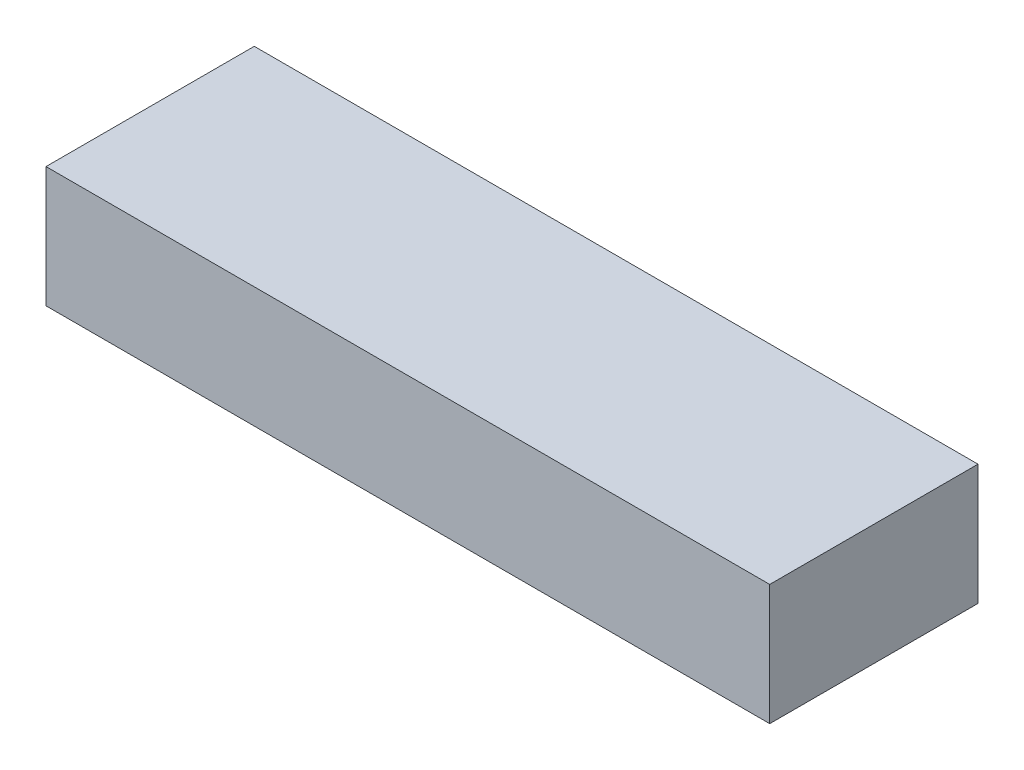
ISO-10303-21;
HEADER;
FILE_DESCRIPTION(('STEP AP214'),'2;1');
FILE_NAME('part.step','',(''),(''),'','','');
FILE_SCHEMA(('AUTOMOTIVE_DESIGN { 1 0 10303 214 1 1 1 1 }'));
ENDSEC;
DATA;
#1=APPLICATION_CONTEXT('core data for automotive mechanical design processes');
#2=APPLICATION_PROTOCOL_DEFINITION('international standard','automotive_design',2000,#1);
#3=PRODUCT_CONTEXT('',#1,'mechanical');
#4=PRODUCT('Part','Part','',(#3));
#5=PRODUCT_RELATED_PRODUCT_CATEGORY('part','',(#4));
#6=PRODUCT_DEFINITION_FORMATION('','',#4);
#7=PRODUCT_DEFINITION_CONTEXT('part definition',#1,'design');
#8=PRODUCT_DEFINITION('design','',#6,#7);
#9=PRODUCT_DEFINITION_SHAPE('','',#8);
#10=(LENGTH_UNIT() NAMED_UNIT(*) SI_UNIT(.MILLI.,.METRE.));
#11=(NAMED_UNIT(*) PLANE_ANGLE_UNIT() SI_UNIT($,.RADIAN.));
#12=(NAMED_UNIT(*) SI_UNIT($,.STERADIAN.) SOLID_ANGLE_UNIT());
#13=UNCERTAINTY_MEASURE_WITH_UNIT(LENGTH_MEASURE(1.E-05),#10,'distance_accuracy_value','');
#14=(GEOMETRIC_REPRESENTATION_CONTEXT(3) GLOBAL_UNCERTAINTY_ASSIGNED_CONTEXT((#13)) GLOBAL_UNIT_ASSIGNED_CONTEXT((#10,
#11,#12)) REPRESENTATION_CONTEXT('',''));
#15=CARTESIAN_POINT('',(0.,0.,0.));
#16=DIRECTION('',(0.,0.,1.));
#17=DIRECTION('',(1.,0.,0.));
#18=AXIS2_PLACEMENT_3D('',#15,#16,#17);
#19=CARTESIAN_POINT('',(0.,3.,0.));
#20=DIRECTION('',(1.,0.,0.));
#21=DIRECTION('',(0.,0.,-1.));
#22=AXIS2_PLACEMENT_3D('',#19,#20,#21);
#23=PLANE('',#22);
#24=DIRECTION('',(0.,0.,1.));
#25=VECTOR('',#24,1.);
#26=CARTESIAN_POINT('',(0.,0.,0.));
#27=LINE('',#26,#25);
#28=CARTESIAN_POINT('',(0.,0.,-5.18));
#29=VERTEX_POINT('',#28);
#30=CARTESIAN_POINT('',(0.,0.,0.));
#31=VERTEX_POINT('',#30);
#32=EDGE_CURVE('E95',#29,#31,#27,.T.);
#33=ORIENTED_EDGE('',*,*,#32,.T.);
#34=DIRECTION('',(0.,-1.,0.));
#35=VECTOR('',#34,1.);
#36=CARTESIAN_POINT('',(0.,3.,0.));
#37=LINE('',#36,#35);
#38=CARTESIAN_POINT('',(0.,3.,0.));
#39=VERTEX_POINT('',#38);
#40=EDGE_CURVE('E11',#39,#31,#37,.T.);
#41=ORIENTED_EDGE('',*,*,#40,.F.);
#42=DIRECTION('',(0.,0.,1.));
#43=VECTOR('',#42,1.);
#44=CARTESIAN_POINT('',(0.,3.,0.));
#45=LINE('',#44,#43);
#46=CARTESIAN_POINT('',(0.,3.,-5.18));
#47=VERTEX_POINT('',#46);
#48=EDGE_CURVE('E83',#47,#39,#45,.T.);
#49=ORIENTED_EDGE('',*,*,#48,.F.);
#50=DIRECTION('',(0.,-1.,0.));
#51=VECTOR('',#50,1.);
#52=CARTESIAN_POINT('',(0.,3.,-5.18));
#53=LINE('',#52,#51);
#54=EDGE_CURVE('E91',#47,#29,#53,.T.);
#55=ORIENTED_EDGE('',*,*,#54,.T.);
#56=EDGE_LOOP('',(#33,#41,#49,#55));
#57=FACE_BOUND('',#56,.T.);
#58=ADVANCED_FACE('F32',(#57),#23,.F.);
#59=CARTESIAN_POINT('',(0.,3.,0.));
#60=DIRECTION('',(0.,0.,-1.));
#61=DIRECTION('',(-1.,0.,0.));
#62=AXIS2_PLACEMENT_3D('',#59,#60,#61);
#63=PLANE('',#62);
#64=DIRECTION('',(1.,0.,0.));
#65=VECTOR('',#64,1.);
#66=CARTESIAN_POINT('',(0.,0.,0.));
#67=LINE('',#66,#65);
#68=CARTESIAN_POINT('',(18.,0.,0.));
#69=VERTEX_POINT('',#68);
#70=EDGE_CURVE('E87',#31,#69,#67,.T.);
#71=ORIENTED_EDGE('',*,*,#70,.T.);
#72=DIRECTION('',(0.,-1.,0.));
#73=VECTOR('',#72,1.);
#74=CARTESIAN_POINT('',(18.,3.,0.));
#75=LINE('',#74,#73);
#76=CARTESIAN_POINT('',(18.,3.,0.));
#77=VERTEX_POINT('',#76);
#78=EDGE_CURVE('E40',#77,#69,#75,.T.);
#79=ORIENTED_EDGE('',*,*,#78,.F.);
#80=DIRECTION('',(1.,0.,0.));
#81=VECTOR('',#80,1.);
#82=CARTESIAN_POINT('',(0.,3.,0.));
#83=LINE('',#82,#81);
#84=EDGE_CURVE('E78',#39,#77,#83,.T.);
#85=ORIENTED_EDGE('',*,*,#84,.F.);
#86=ORIENTED_EDGE('',*,*,#40,.T.);
#87=EDGE_LOOP('',(#71,#79,#85,#86));
#88=FACE_BOUND('',#87,.T.);
#89=ADVANCED_FACE('F86',(#88),#63,.F.);
#90=CARTESIAN_POINT('',(18.,3.,0.));
#91=DIRECTION('',(-1.,0.,0.));
#92=DIRECTION('',(0.,0.,1.));
#93=AXIS2_PLACEMENT_3D('',#90,#91,#92);
#94=PLANE('',#93);
#95=DIRECTION('',(0.,0.,-1.));
#96=VECTOR('',#95,1.);
#97=CARTESIAN_POINT('',(18.,0.,0.));
#98=LINE('',#97,#96);
#99=CARTESIAN_POINT('',(18.,0.,-5.18));
#100=VERTEX_POINT('',#99);
#101=EDGE_CURVE('E65',#69,#100,#98,.T.);
#102=ORIENTED_EDGE('',*,*,#101,.T.);
#103=DIRECTION('',(0.,-1.,0.));
#104=VECTOR('',#103,1.);
#105=CARTESIAN_POINT('',(18.,3.,-5.18));
#106=LINE('',#105,#104);
#107=CARTESIAN_POINT('',(18.,3.,-5.18));
#108=VERTEX_POINT('',#107);
#109=EDGE_CURVE('E88',#108,#100,#106,.T.);
#110=ORIENTED_EDGE('',*,*,#109,.F.);
#111=DIRECTION('',(0.,0.,-1.));
#112=VECTOR('',#111,1.);
#113=CARTESIAN_POINT('',(18.,3.,0.));
#114=LINE('',#113,#112);
#115=EDGE_CURVE('E81',#77,#108,#114,.T.);
#116=ORIENTED_EDGE('',*,*,#115,.F.);
#117=ORIENTED_EDGE('',*,*,#78,.T.);
#118=EDGE_LOOP('',(#102,#110,#116,#117));
#119=FACE_BOUND('',#118,.T.);
#120=ADVANCED_FACE('F89',(#119),#94,.F.);
#121=CARTESIAN_POINT('',(0.,3.,-5.18));
#122=DIRECTION('',(0.,0.,1.));
#123=DIRECTION('',(1.,0.,0.));
#124=AXIS2_PLACEMENT_3D('',#121,#122,#123);
#125=PLANE('',#124);
#126=DIRECTION('',(-1.,0.,0.));
#127=VECTOR('',#126,1.);
#128=CARTESIAN_POINT('',(0.,0.,-5.18));
#129=LINE('',#128,#127);
#130=EDGE_CURVE('E71',#100,#29,#129,.T.);
#131=ORIENTED_EDGE('',*,*,#130,.T.);
#132=ORIENTED_EDGE('',*,*,#54,.F.);
#133=DIRECTION('',(-1.,0.,0.));
#134=VECTOR('',#133,1.);
#135=CARTESIAN_POINT('',(0.,3.,-5.18));
#136=LINE('',#135,#134);
#137=EDGE_CURVE('E48',#108,#47,#136,.T.);
#138=ORIENTED_EDGE('',*,*,#137,.F.);
#139=ORIENTED_EDGE('',*,*,#109,.T.);
#140=EDGE_LOOP('',(#131,#132,#138,#139));
#141=FACE_BOUND('',#140,.T.);
#142=ADVANCED_FACE('F102',(#141),#125,.F.);
#143=CARTESIAN_POINT('',(0.,3.,0.));
#144=DIRECTION('',(0.,-1.,0.));
#145=DIRECTION('',(0.,0.,-1.));
#146=AXIS2_PLACEMENT_3D('',#143,#144,#145);
#147=PLANE('',#146);
#148=ORIENTED_EDGE('',*,*,#48,.T.);
#149=ORIENTED_EDGE('',*,*,#84,.T.);
#150=ORIENTED_EDGE('',*,*,#115,.T.);
#151=ORIENTED_EDGE('',*,*,#137,.T.);
#152=EDGE_LOOP('',(#148,#149,#150,#151));
#153=FACE_BOUND('',#152,.T.);
#154=ADVANCED_FACE('F79',(#153),#147,.F.);
#155=CARTESIAN_POINT('',(0.,0.,0.));
#156=DIRECTION('',(0.,-1.,0.));
#157=DIRECTION('',(0.,0.,-1.));
#158=AXIS2_PLACEMENT_3D('',#155,#156,#157);
#159=PLANE('',#158);
#160=ORIENTED_EDGE('',*,*,#32,.F.);
#161=ORIENTED_EDGE('',*,*,#130,.F.);
#162=ORIENTED_EDGE('',*,*,#101,.F.);
#163=ORIENTED_EDGE('',*,*,#70,.F.);
#164=EDGE_LOOP('',(#160,#161,#162,#163));
#165=FACE_BOUND('',#164,.T.);
#166=ADVANCED_FACE('F105',(#165),#159,.T.);
#167=CLOSED_SHELL('',(#58,#89,#120,#142,#154,#166));
#168=MANIFOLD_SOLID_BREP('B2',#167);
#169=ADVANCED_BREP_SHAPE_REPRESENTATION('',(#18,#168),#14);
#170=SHAPE_DEFINITION_REPRESENTATION(#9,#169);
ENDSEC;
END-ISO-10303-21;
